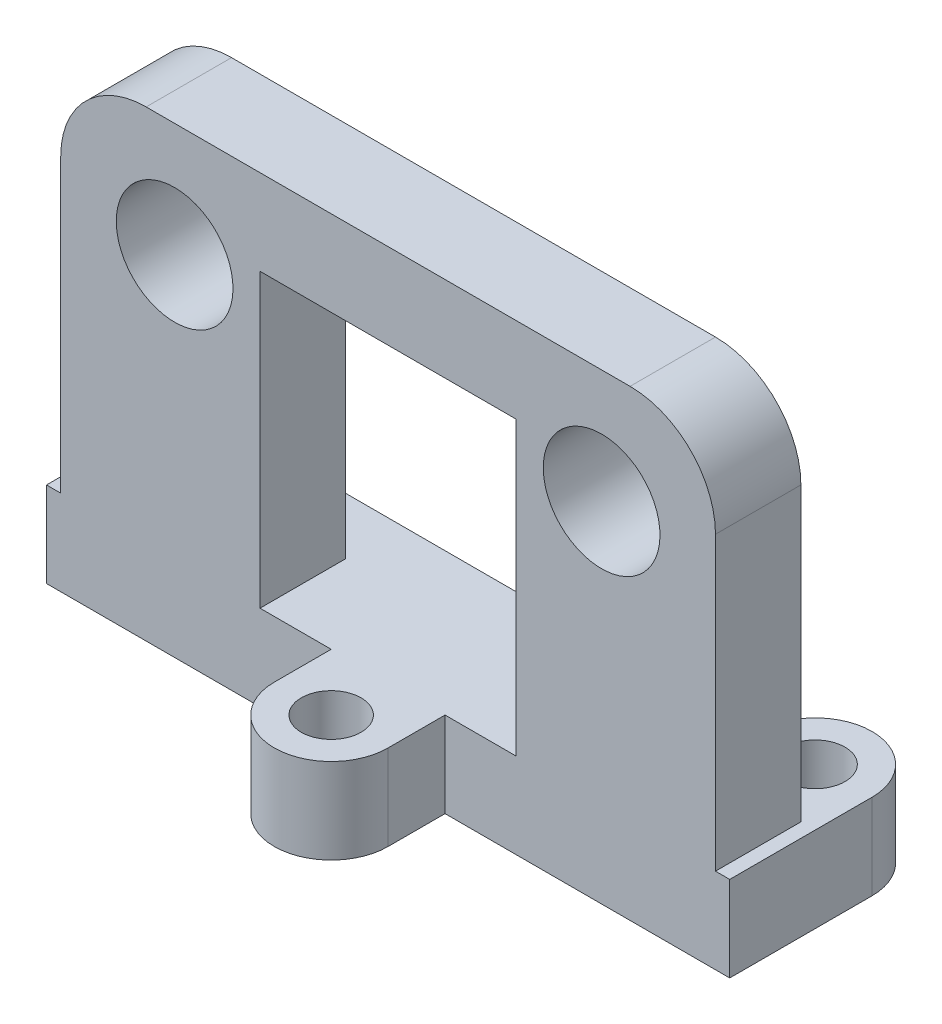
ISO-10303-21;
HEADER;
FILE_DESCRIPTION(('STEP AP214'),'2;1');
FILE_NAME('part.step','',(''),(''),'','','');
FILE_SCHEMA(('AUTOMOTIVE_DESIGN { 1 0 10303 214 1 1 1 1 }'));
ENDSEC;
DATA;
#1=APPLICATION_CONTEXT('core data for automotive mechanical design processes');
#2=APPLICATION_PROTOCOL_DEFINITION('international standard','automotive_design',2000,#1);
#3=PRODUCT_CONTEXT('',#1,'mechanical');
#4=PRODUCT('Part','Part','',(#3));
#5=PRODUCT_RELATED_PRODUCT_CATEGORY('part','',(#4));
#6=PRODUCT_DEFINITION_FORMATION('','',#4);
#7=PRODUCT_DEFINITION_CONTEXT('part definition',#1,'design');
#8=PRODUCT_DEFINITION('design','',#6,#7);
#9=PRODUCT_DEFINITION_SHAPE('','',#8);
#10=(LENGTH_UNIT() NAMED_UNIT(*) SI_UNIT(.MILLI.,.METRE.));
#11=(NAMED_UNIT(*) PLANE_ANGLE_UNIT() SI_UNIT($,.RADIAN.));
#12=(NAMED_UNIT(*) SI_UNIT($,.STERADIAN.) SOLID_ANGLE_UNIT());
#13=UNCERTAINTY_MEASURE_WITH_UNIT(LENGTH_MEASURE(1.E-05),#10,'distance_accuracy_value','');
#14=(GEOMETRIC_REPRESENTATION_CONTEXT(3) GLOBAL_UNCERTAINTY_ASSIGNED_CONTEXT((#13)) GLOBAL_UNIT_ASSIGNED_CONTEXT((#10,
#11,#12)) REPRESENTATION_CONTEXT('',''));
#15=CARTESIAN_POINT('',(0.,0.,0.));
#16=DIRECTION('',(0.,0.,1.));
#17=DIRECTION('',(1.,0.,0.));
#18=AXIS2_PLACEMENT_3D('',#15,#16,#17);
#19=CARTESIAN_POINT('',(16.,16.25,18.));
#20=DIRECTION('',(1.,0.,0.));
#21=DIRECTION('',(0.,1.,0.));
#22=AXIS2_PLACEMENT_3D('',#19,#20,#21);
#23=PLANE('',#22);
#24=DIRECTION('',(0.,0.,1.));
#25=VECTOR('',#24,1.);
#26=CARTESIAN_POINT('',(16.,13.25,0.));
#27=LINE('',#26,#25);
#28=CARTESIAN_POINT('',(16.,13.25,-3.));
#29=VERTEX_POINT('',#28);
#30=CARTESIAN_POINT('',(16.,13.25,0.));
#31=VERTEX_POINT('',#30);
#32=EDGE_CURVE('E203',#29,#31,#27,.T.);
#33=ORIENTED_EDGE('',*,*,#32,.F.);
#34=DIRECTION('',(0.,-1.,0.));
#35=VECTOR('',#34,1.);
#36=CARTESIAN_POINT('',(16.,16.25,-3.));
#37=LINE('',#36,#35);
#38=CARTESIAN_POINT('',(16.,3.,-3.));
#39=VERTEX_POINT('',#38);
#40=EDGE_CURVE('E196',#29,#39,#37,.T.);
#41=ORIENTED_EDGE('',*,*,#40,.T.);
#42=DIRECTION('',(0.,0.,-1.));
#43=VECTOR('',#42,1.);
#44=CARTESIAN_POINT('',(16.,3.,18.));
#45=LINE('',#44,#43);
#46=CARTESIAN_POINT('',(16.,3.,0.));
#47=VERTEX_POINT('',#46);
#48=EDGE_CURVE('E207',#47,#39,#45,.T.);
#49=ORIENTED_EDGE('',*,*,#48,.F.);
#50=DIRECTION('',(0.,-1.,0.));
#51=VECTOR('',#50,1.);
#52=CARTESIAN_POINT('',(16.,0.,0.));
#53=LINE('',#52,#51);
#54=EDGE_CURVE('E257',#31,#47,#53,.T.);
#55=ORIENTED_EDGE('',*,*,#54,.F.);
#56=EDGE_LOOP('',(#33,#41,#49,#55));
#57=FACE_BOUND('',#56,.T.);
#58=ADVANCED_FACE('F41',(#57),#23,.F.);
#59=CARTESIAN_POINT('',(7.,16.25,18.));
#60=DIRECTION('',(-1.,0.,0.));
#61=DIRECTION('',(0.,-1.,0.));
#62=AXIS2_PLACEMENT_3D('',#59,#60,#61);
#63=PLANE('',#62);
#64=DIRECTION('',(0.,0.,1.));
#65=VECTOR('',#64,1.);
#66=CARTESIAN_POINT('',(7.,13.25,0.));
#67=LINE('',#66,#65);
#68=CARTESIAN_POINT('',(7.,13.25,-3.));
#69=VERTEX_POINT('',#68);
#70=CARTESIAN_POINT('',(7.,13.25,0.));
#71=VERTEX_POINT('',#70);
#72=EDGE_CURVE('E177',#69,#71,#67,.T.);
#73=ORIENTED_EDGE('',*,*,#72,.T.);
#74=DIRECTION('',(0.,1.,0.));
#75=VECTOR('',#74,1.);
#76=CARTESIAN_POINT('',(7.,0.,0.));
#77=LINE('',#76,#75);
#78=CARTESIAN_POINT('',(7.,3.,0.));
#79=VERTEX_POINT('',#78);
#80=EDGE_CURVE('E258',#79,#71,#77,.T.);
#81=ORIENTED_EDGE('',*,*,#80,.F.);
#82=DIRECTION('',(0.,0.,-1.));
#83=VECTOR('',#82,1.);
#84=CARTESIAN_POINT('',(7.,3.,18.));
#85=LINE('',#84,#83);
#86=CARTESIAN_POINT('',(7.,3.,-3.));
#87=VERTEX_POINT('',#86);
#88=EDGE_CURVE('E201',#79,#87,#85,.T.);
#89=ORIENTED_EDGE('',*,*,#88,.T.);
#90=DIRECTION('',(0.,1.,0.));
#91=VECTOR('',#90,1.);
#92=CARTESIAN_POINT('',(7.,16.25,-3.));
#93=LINE('',#92,#91);
#94=EDGE_CURVE('E199',#87,#69,#93,.T.);
#95=ORIENTED_EDGE('',*,*,#94,.T.);
#96=EDGE_LOOP('',(#73,#81,#89,#95));
#97=FACE_BOUND('',#96,.T.);
#98=ADVANCED_FACE('F202',(#97),#63,.F.);
#99=CARTESIAN_POINT('',(23.,3.,-5.));
#100=DIRECTION('',(0.,0.,1.));
#101=DIRECTION('',(1.,0.,0.));
#102=AXIS2_PLACEMENT_3D('',#99,#100,#101);
#103=PLANE('',#102);
#104=DIRECTION('',(0.,1.,0.));
#105=VECTOR('',#104,1.);
#106=CARTESIAN_POINT('',(19.5,-8.06225774829855,-5.));
#107=LINE('',#106,#105);
#108=CARTESIAN_POINT('',(19.5,0.,-5.));
#109=VERTEX_POINT('',#108);
#110=CARTESIAN_POINT('',(19.5,3.,-5.));
#111=VERTEX_POINT('',#110);
#112=EDGE_CURVE('E364',#109,#111,#107,.T.);
#113=ORIENTED_EDGE('',*,*,#112,.F.);
#114=DIRECTION('',(-1.,0.,0.));
#115=VECTOR('',#114,1.);
#116=CARTESIAN_POINT('',(23.,0.,-5.));
#117=LINE('',#116,#115);
#118=CARTESIAN_POINT('',(3.5,0.,-5.));
#119=VERTEX_POINT('',#118);
#120=EDGE_CURVE('E249',#109,#119,#117,.T.);
#121=ORIENTED_EDGE('',*,*,#120,.T.);
#122=DIRECTION('',(0.,1.,0.));
#123=VECTOR('',#122,1.);
#124=CARTESIAN_POINT('',(3.5,-8.06225774829855,-5.));
#125=LINE('',#124,#123);
#126=CARTESIAN_POINT('',(3.5,3.,-5.));
#127=VERTEX_POINT('',#126);
#128=EDGE_CURVE('E308',#119,#127,#125,.T.);
#129=ORIENTED_EDGE('',*,*,#128,.T.);
#130=DIRECTION('',(-1.,0.,0.));
#131=VECTOR('',#130,1.);
#132=CARTESIAN_POINT('',(23.,3.,-5.));
#133=LINE('',#132,#131);
#134=EDGE_CURVE('E247',#111,#127,#133,.T.);
#135=ORIENTED_EDGE('',*,*,#134,.F.);
#136=EDGE_LOOP('',(#113,#121,#129,#135));
#137=FACE_BOUND('',#136,.T.);
#138=ADVANCED_FACE('F423',(#137),#103,.F.);
#139=CARTESIAN_POINT('',(23.,0.,-5.));
#140=DIRECTION('',(0.,1.,0.));
#141=DIRECTION('',(0.,0.,1.));
#142=AXIS2_PLACEMENT_3D('',#139,#140,#141);
#143=PLANE('',#142);
#144=CARTESIAN_POINT('',(1.5,0.,-5.));
#145=DIRECTION('',(0.,1.,0.));
#146=DIRECTION('',(0.,0.,1.));
#147=AXIS2_PLACEMENT_3D('',#144,#145,#146);
#148=CIRCLE('',#147,1.05);
#149=CARTESIAN_POINT('',(1.5,0.,-3.95));
#150=VERTEX_POINT('',#149);
#151=EDGE_CURVE('E385',#150,#150,#148,.T.);
#152=ORIENTED_EDGE('',*,*,#151,.T.);
#153=EDGE_LOOP('',(#152));
#154=FACE_BOUND('',#153,.T.);
#155=CARTESIAN_POINT('',(11.5,0.,2.));
#156=DIRECTION('',(0.,1.,0.));
#157=DIRECTION('',(0.,0.,1.));
#158=AXIS2_PLACEMENT_3D('',#155,#156,#157);
#159=CIRCLE('',#158,1.05);
#160=CARTESIAN_POINT('',(11.5,0.,3.05));
#161=VERTEX_POINT('',#160);
#162=EDGE_CURVE('E387',#161,#161,#159,.T.);
#163=ORIENTED_EDGE('',*,*,#162,.T.);
#164=EDGE_LOOP('',(#163));
#165=FACE_BOUND('',#164,.T.);
#166=CARTESIAN_POINT('',(21.5,0.,-5.));
#167=DIRECTION('',(0.,1.,0.));
#168=DIRECTION('',(0.,0.,1.));
#169=AXIS2_PLACEMENT_3D('',#166,#167,#168);
#170=CIRCLE('',#169,1.05);
#171=CARTESIAN_POINT('',(21.5,0.,-3.95));
#172=VERTEX_POINT('',#171);
#173=EDGE_CURVE('E359',#172,#172,#170,.T.);
#174=ORIENTED_EDGE('',*,*,#173,.T.);
#175=EDGE_LOOP('',(#174));
#176=FACE_BOUND('',#175,.T.);
#177=ORIENTED_EDGE('',*,*,#120,.F.);
#178=CARTESIAN_POINT('',(21.5,0.,-5.));
#179=DIRECTION('',(0.,1.,0.));
#180=DIRECTION('',(0.,0.,1.));
#181=AXIS2_PLACEMENT_3D('',#178,#179,#180);
#182=CIRCLE('',#181,2.);
#183=CARTESIAN_POINT('',(23.5,0.,-5.));
#184=VERTEX_POINT('',#183);
#185=EDGE_CURVE('E343',#184,#109,#182,.T.);
#186=ORIENTED_EDGE('',*,*,#185,.F.);
#187=DIRECTION('',(0.,0.,-1.));
#188=VECTOR('',#187,1.);
#189=CARTESIAN_POINT('',(23.5,0.,0.));
#190=LINE('',#189,#188);
#191=CARTESIAN_POINT('',(23.5,0.,0.));
#192=VERTEX_POINT('',#191);
#193=EDGE_CURVE('E330',#192,#184,#190,.T.);
#194=ORIENTED_EDGE('',*,*,#193,.F.);
#195=DIRECTION('',(-1.,0.,0.));
#196=VECTOR('',#195,1.);
#197=CARTESIAN_POINT('',(23.,0.,0.));
#198=LINE('',#197,#196);
#199=CARTESIAN_POINT('',(13.5,0.,0.));
#200=VERTEX_POINT('',#199);
#201=EDGE_CURVE('E240',#192,#200,#198,.T.);
#202=ORIENTED_EDGE('',*,*,#201,.T.);
#203=DIRECTION('',(0.,0.,-1.));
#204=VECTOR('',#203,1.);
#205=CARTESIAN_POINT('',(13.5,0.,0.));
#206=LINE('',#205,#204);
#207=CARTESIAN_POINT('',(13.5,0.,2.));
#208=VERTEX_POINT('',#207);
#209=EDGE_CURVE('E361',#208,#200,#206,.T.);
#210=ORIENTED_EDGE('',*,*,#209,.F.);
#211=CARTESIAN_POINT('',(11.5,0.,2.));
#212=DIRECTION('',(0.,1.,0.));
#213=DIRECTION('',(0.,0.,1.));
#214=AXIS2_PLACEMENT_3D('',#211,#212,#213);
#215=CIRCLE('',#214,2.);
#216=CARTESIAN_POINT('',(9.5,0.,2.));
#217=VERTEX_POINT('',#216);
#218=EDGE_CURVE('E357',#208,#217,#215,.F.);
#219=ORIENTED_EDGE('',*,*,#218,.T.);
#220=DIRECTION('',(0.,0.,1.));
#221=VECTOR('',#220,1.);
#222=CARTESIAN_POINT('',(9.5,0.,2.));
#223=LINE('',#222,#221);
#224=CARTESIAN_POINT('',(9.5,0.,0.));
#225=VERTEX_POINT('',#224);
#226=EDGE_CURVE('E360',#225,#217,#223,.T.);
#227=ORIENTED_EDGE('',*,*,#226,.F.);
#228=CARTESIAN_POINT('',(-0.5,0.,0.));
#229=VERTEX_POINT('',#228);
#230=EDGE_CURVE('E234',#225,#229,#198,.T.);
#231=ORIENTED_EDGE('',*,*,#230,.T.);
#232=DIRECTION('',(0.,0.,-1.));
#233=VECTOR('',#232,1.);
#234=CARTESIAN_POINT('',(-0.5,0.,0.));
#235=LINE('',#234,#233);
#236=CARTESIAN_POINT('',(-0.5,0.,-5.));
#237=VERTEX_POINT('',#236);
#238=EDGE_CURVE('E316',#229,#237,#235,.T.);
#239=ORIENTED_EDGE('',*,*,#238,.T.);
#240=CARTESIAN_POINT('',(1.5,0.,-5.));
#241=DIRECTION('',(0.,1.,0.));
#242=DIRECTION('',(0.,0.,1.));
#243=AXIS2_PLACEMENT_3D('',#240,#241,#242);
#244=CIRCLE('',#243,2.);
#245=EDGE_CURVE('E208',#237,#119,#244,.F.);
#246=ORIENTED_EDGE('',*,*,#245,.T.);
#247=EDGE_LOOP('',(#177,#186,#194,#202,#210,#219,#227,#231,#239,#246));
#248=FACE_BOUND('',#247,.T.);
#249=ADVANCED_FACE('F415',(#154,#165,#176,#248),#143,.F.);
#250=CARTESIAN_POINT('',(23.,3.,-3.));
#251=DIRECTION('',(0.,-1.,0.));
#252=DIRECTION('',(0.,0.,-1.));
#253=AXIS2_PLACEMENT_3D('',#250,#251,#252);
#254=PLANE('',#253);
#255=CARTESIAN_POINT('',(1.5,3.,-5.));
#256=DIRECTION('',(0.,1.,0.));
#257=DIRECTION('',(0.,0.,1.));
#258=AXIS2_PLACEMENT_3D('',#255,#256,#257);
#259=CIRCLE('',#258,1.05);
#260=CARTESIAN_POINT('',(1.5,3.,-3.95));
#261=VERTEX_POINT('',#260);
#262=EDGE_CURVE('E188',#261,#261,#259,.T.);
#263=ORIENTED_EDGE('',*,*,#262,.F.);
#264=EDGE_LOOP('',(#263));
#265=FACE_BOUND('',#264,.T.);
#266=CARTESIAN_POINT('',(11.5,3.,2.));
#267=DIRECTION('',(0.,1.,0.));
#268=DIRECTION('',(0.,0.,1.));
#269=AXIS2_PLACEMENT_3D('',#266,#267,#268);
#270=CIRCLE('',#269,1.05);
#271=CARTESIAN_POINT('',(11.5,3.,3.05));
#272=VERTEX_POINT('',#271);
#273=EDGE_CURVE('E383',#272,#272,#270,.T.);
#274=ORIENTED_EDGE('',*,*,#273,.F.);
#275=EDGE_LOOP('',(#274));
#276=FACE_BOUND('',#275,.T.);
#277=CARTESIAN_POINT('',(21.5,3.,-5.));
#278=DIRECTION('',(0.,1.,0.));
#279=DIRECTION('',(0.,0.,1.));
#280=AXIS2_PLACEMENT_3D('',#277,#278,#279);
#281=CIRCLE('',#280,1.05);
#282=CARTESIAN_POINT('',(21.5,3.,-3.95));
#283=VERTEX_POINT('',#282);
#284=EDGE_CURVE('E393',#283,#283,#281,.T.);
#285=ORIENTED_EDGE('',*,*,#284,.F.);
#286=EDGE_LOOP('',(#285));
#287=FACE_BOUND('',#286,.T.);
#288=CARTESIAN_POINT('',(21.5,3.,-5.));
#289=DIRECTION('',(0.,1.,0.));
#290=DIRECTION('',(0.,0.,1.));
#291=AXIS2_PLACEMENT_3D('',#288,#289,#290);
#292=CIRCLE('',#291,2.);
#293=CARTESIAN_POINT('',(23.5,3.,-5.));
#294=VERTEX_POINT('',#293);
#295=EDGE_CURVE('E333',#111,#294,#292,.F.);
#296=ORIENTED_EDGE('',*,*,#295,.F.);
#297=ORIENTED_EDGE('',*,*,#134,.T.);
#298=CARTESIAN_POINT('',(1.5,3.,-5.));
#299=DIRECTION('',(0.,1.,0.));
#300=DIRECTION('',(0.,0.,1.));
#301=AXIS2_PLACEMENT_3D('',#298,#299,#300);
#302=CIRCLE('',#301,2.);
#303=CARTESIAN_POINT('',(-0.5,3.,-5.));
#304=VERTEX_POINT('',#303);
#305=EDGE_CURVE('E312',#127,#304,#302,.T.);
#306=ORIENTED_EDGE('',*,*,#305,.T.);
#307=DIRECTION('',(0.,0.,1.));
#308=VECTOR('',#307,1.);
#309=CARTESIAN_POINT('',(-0.5,3.,0.));
#310=LINE('',#309,#308);
#311=CARTESIAN_POINT('',(-0.5,3.,0.));
#312=VERTEX_POINT('',#311);
#313=EDGE_CURVE('E306',#304,#312,#310,.T.);
#314=ORIENTED_EDGE('',*,*,#313,.T.);
#315=DIRECTION('',(1.,0.,0.));
#316=VECTOR('',#315,1.);
#317=CARTESIAN_POINT('',(0.,3.,0.));
#318=LINE('',#317,#316);
#319=CARTESIAN_POINT('',(0.,3.,0.));
#320=VERTEX_POINT('',#319);
#321=EDGE_CURVE('E303',#312,#320,#318,.T.);
#322=ORIENTED_EDGE('',*,*,#321,.T.);
#323=DIRECTION('',(0.,0.,-1.));
#324=VECTOR('',#323,1.);
#325=CARTESIAN_POINT('',(0.,3.,0.));
#326=LINE('',#325,#324);
#327=CARTESIAN_POINT('',(0.,3.,-3.));
#328=VERTEX_POINT('',#327);
#329=EDGE_CURVE('E256',#320,#328,#326,.T.);
#330=ORIENTED_EDGE('',*,*,#329,.T.);
#331=DIRECTION('',(-1.,0.,0.));
#332=VECTOR('',#331,1.);
#333=CARTESIAN_POINT('',(23.,3.,-3.));
#334=LINE('',#333,#332);
#335=EDGE_CURVE('E244',#87,#328,#334,.T.);
#336=ORIENTED_EDGE('',*,*,#335,.F.);
#337=ORIENTED_EDGE('',*,*,#88,.F.);
#338=DIRECTION('',(-1.,0.,0.));
#339=VECTOR('',#338,1.);
#340=CARTESIAN_POINT('',(23.,3.,0.));
#341=LINE('',#340,#339);
#342=CARTESIAN_POINT('',(9.5,3.,0.));
#343=VERTEX_POINT('',#342);
#344=EDGE_CURVE('E255',#343,#79,#341,.T.);
#345=ORIENTED_EDGE('',*,*,#344,.F.);
#346=DIRECTION('',(0.,0.,-1.));
#347=VECTOR('',#346,1.);
#348=CARTESIAN_POINT('',(9.5,3.,2.));
#349=LINE('',#348,#347);
#350=CARTESIAN_POINT('',(9.5,3.,2.));
#351=VERTEX_POINT('',#350);
#352=EDGE_CURVE('E352',#351,#343,#349,.T.);
#353=ORIENTED_EDGE('',*,*,#352,.F.);
#354=CARTESIAN_POINT('',(11.5,3.,2.));
#355=DIRECTION('',(0.,1.,0.));
#356=DIRECTION('',(0.,0.,1.));
#357=AXIS2_PLACEMENT_3D('',#354,#355,#356);
#358=CIRCLE('',#357,2.);
#359=CARTESIAN_POINT('',(13.5,3.,2.));
#360=VERTEX_POINT('',#359);
#361=EDGE_CURVE('E342',#351,#360,#358,.T.);
#362=ORIENTED_EDGE('',*,*,#361,.T.);
#363=DIRECTION('',(0.,0.,1.));
#364=VECTOR('',#363,1.);
#365=CARTESIAN_POINT('',(13.5,3.,0.));
#366=LINE('',#365,#364);
#367=CARTESIAN_POINT('',(13.5,3.,0.));
#368=VERTEX_POINT('',#367);
#369=EDGE_CURVE('E349',#368,#360,#366,.T.);
#370=ORIENTED_EDGE('',*,*,#369,.F.);
#371=EDGE_CURVE('E254',#47,#368,#341,.T.);
#372=ORIENTED_EDGE('',*,*,#371,.F.);
#373=ORIENTED_EDGE('',*,*,#48,.T.);
#374=CARTESIAN_POINT('',(23.,3.,-3.));
#375=VERTEX_POINT('',#374);
#376=EDGE_CURVE('E246',#375,#39,#334,.T.);
#377=ORIENTED_EDGE('',*,*,#376,.F.);
#378=DIRECTION('',(0.,0.,-1.));
#379=VECTOR('',#378,1.);
#380=CARTESIAN_POINT('',(23.,3.,0.));
#381=LINE('',#380,#379);
#382=CARTESIAN_POINT('',(23.,3.,0.));
#383=VERTEX_POINT('',#382);
#384=EDGE_CURVE('E282',#383,#375,#381,.T.);
#385=ORIENTED_EDGE('',*,*,#384,.F.);
#386=DIRECTION('',(-1.,0.,0.));
#387=VECTOR('',#386,1.);
#388=CARTESIAN_POINT('',(0.,3.,0.));
#389=LINE('',#388,#387);
#390=CARTESIAN_POINT('',(23.5,3.,0.));
#391=VERTEX_POINT('',#390);
#392=EDGE_CURVE('E336',#391,#383,#389,.T.);
#393=ORIENTED_EDGE('',*,*,#392,.F.);
#394=DIRECTION('',(0.,0.,1.));
#395=VECTOR('',#394,1.);
#396=CARTESIAN_POINT('',(23.5,3.,0.));
#397=LINE('',#396,#395);
#398=EDGE_CURVE('E366',#294,#391,#397,.T.);
#399=ORIENTED_EDGE('',*,*,#398,.F.);
#400=EDGE_LOOP('',(#296,#297,#306,#314,#322,#330,#336,#337,#345,#353,#362,#370,#372,#373,#377,
#385,#393,#399));
#401=FACE_BOUND('',#400,.T.);
#402=ADVANCED_FACE('F301',(#265,#276,#287,#401),#254,.F.);
#403=CARTESIAN_POINT('',(23.,16.25,-3.));
#404=DIRECTION('',(0.,0.,1.));
#405=DIRECTION('',(0.,-1.,0.));
#406=AXIS2_PLACEMENT_3D('',#403,#404,#405);
#407=PLANE('',#406);
#408=CARTESIAN_POINT('',(4.,12.25,-3.));
#409=DIRECTION('',(0.,0.,-1.));
#410=DIRECTION('',(0.,1.,0.));
#411=AXIS2_PLACEMENT_3D('',#408,#409,#410);
#412=CIRCLE('',#411,2.05);
#413=CARTESIAN_POINT('',(4.,14.3,-3.));
#414=VERTEX_POINT('',#413);
#415=EDGE_CURVE('E223',#414,#414,#412,.T.);
#416=ORIENTED_EDGE('',*,*,#415,.F.);
#417=EDGE_LOOP('',(#416));
#418=FACE_BOUND('',#417,.T.);
#419=DIRECTION('',(-1.,0.,0.));
#420=VECTOR('',#419,1.);
#421=CARTESIAN_POINT('',(23.,16.25,-3.));
#422=LINE('',#421,#420);
#423=CARTESIAN_POINT('',(20.,16.25,-3.));
#424=VERTEX_POINT('',#423);
#425=CARTESIAN_POINT('',(3.,16.25,-3.));
#426=VERTEX_POINT('',#425);
#427=EDGE_CURVE('E243',#424,#426,#422,.T.);
#428=ORIENTED_EDGE('',*,*,#427,.F.);
#429=CARTESIAN_POINT('',(20.,13.25,-3.));
#430=DIRECTION('',(0.,0.,1.));
#431=DIRECTION('',(0.,-1.,0.));
#432=AXIS2_PLACEMENT_3D('',#429,#430,#431);
#433=CIRCLE('',#432,3.);
#434=CARTESIAN_POINT('',(23.,13.25,-3.));
#435=VERTEX_POINT('',#434);
#436=EDGE_CURVE('E47',#424,#435,#433,.F.);
#437=ORIENTED_EDGE('',*,*,#436,.T.);
#438=DIRECTION('',(0.,1.,0.));
#439=VECTOR('',#438,1.);
#440=CARTESIAN_POINT('',(23.,16.25,-3.));
#441=LINE('',#440,#439);
#442=EDGE_CURVE('E226',#375,#435,#441,.T.);
#443=ORIENTED_EDGE('',*,*,#442,.F.);
#444=ORIENTED_EDGE('',*,*,#376,.T.);
#445=ORIENTED_EDGE('',*,*,#40,.F.);
#446=DIRECTION('',(1.,0.,0.));
#447=VECTOR('',#446,1.);
#448=CARTESIAN_POINT('',(2.75735931288072,13.25,-3.));
#449=LINE('',#448,#447);
#450=EDGE_CURVE('E182',#69,#29,#449,.T.);
#451=ORIENTED_EDGE('',*,*,#450,.F.);
#452=ORIENTED_EDGE('',*,*,#94,.F.);
#453=ORIENTED_EDGE('',*,*,#335,.T.);
#454=DIRECTION('',(0.,1.,0.));
#455=VECTOR('',#454,1.);
#456=CARTESIAN_POINT('',(0.,16.25,-3.));
#457=LINE('',#456,#455);
#458=CARTESIAN_POINT('',(0.,13.25,-3.));
#459=VERTEX_POINT('',#458);
#460=EDGE_CURVE('E227',#328,#459,#457,.T.);
#461=ORIENTED_EDGE('',*,*,#460,.T.);
#462=CARTESIAN_POINT('',(3.,13.25,-3.));
#463=DIRECTION('',(0.,0.,1.));
#464=DIRECTION('',(0.,-1.,0.));
#465=AXIS2_PLACEMENT_3D('',#462,#463,#464);
#466=CIRCLE('',#465,3.);
#467=EDGE_CURVE('E63',#459,#426,#466,.F.);
#468=ORIENTED_EDGE('',*,*,#467,.T.);
#469=EDGE_LOOP('',(#428,#437,#443,#444,#445,#451,#452,#453,#461,#468));
#470=FACE_BOUND('',#469,.T.);
#471=CARTESIAN_POINT('',(19.,12.25,-3.));
#472=DIRECTION('',(0.,0.,-1.));
#473=DIRECTION('',(0.,1.,0.));
#474=AXIS2_PLACEMENT_3D('',#471,#472,#473);
#475=CIRCLE('',#474,2.05);
#476=CARTESIAN_POINT('',(19.,14.3,-3.));
#477=VERTEX_POINT('',#476);
#478=EDGE_CURVE('E215',#477,#477,#475,.T.);
#479=ORIENTED_EDGE('',*,*,#478,.F.);
#480=EDGE_LOOP('',(#479));
#481=FACE_BOUND('',#480,.T.);
#482=ADVANCED_FACE('F195',(#418,#470,#481),#407,.F.);
#483=CARTESIAN_POINT('',(23.,16.25,0.));
#484=DIRECTION('',(0.,-1.,0.));
#485=DIRECTION('',(0.,0.,-1.));
#486=AXIS2_PLACEMENT_3D('',#483,#484,#485);
#487=PLANE('',#486);
#488=DIRECTION('',(-1.,0.,0.));
#489=VECTOR('',#488,1.);
#490=CARTESIAN_POINT('',(23.,16.25,0.));
#491=LINE('',#490,#489);
#492=CARTESIAN_POINT('',(20.,16.25,0.));
#493=VERTEX_POINT('',#492);
#494=CARTESIAN_POINT('',(3.,16.25,0.));
#495=VERTEX_POINT('',#494);
#496=EDGE_CURVE('E239',#493,#495,#491,.T.);
#497=ORIENTED_EDGE('',*,*,#496,.F.);
#498=DIRECTION('',(0.,0.,1.));
#499=VECTOR('',#498,1.);
#500=CARTESIAN_POINT('',(20.,16.25,0.));
#501=LINE('',#500,#499);
#502=EDGE_CURVE('E275',#493,#424,#501,.F.);
#503=ORIENTED_EDGE('',*,*,#502,.T.);
#504=ORIENTED_EDGE('',*,*,#427,.T.);
#505=DIRECTION('',(0.,0.,1.));
#506=VECTOR('',#505,1.);
#507=CARTESIAN_POINT('',(3.,16.25,0.));
#508=LINE('',#507,#506);
#509=EDGE_CURVE('E270',#426,#495,#508,.T.);
#510=ORIENTED_EDGE('',*,*,#509,.T.);
#511=EDGE_LOOP('',(#497,#503,#504,#510));
#512=FACE_BOUND('',#511,.T.);
#513=ADVANCED_FACE('F292',(#512),#487,.F.);
#514=CARTESIAN_POINT('',(23.,0.,0.));
#515=DIRECTION('',(0.,0.,-1.));
#516=DIRECTION('',(-1.,0.,0.));
#517=AXIS2_PLACEMENT_3D('',#514,#515,#516);
#518=PLANE('',#517);
#519=DIRECTION('',(0.,-1.,0.));
#520=VECTOR('',#519,1.);
#521=CARTESIAN_POINT('',(23.,0.,0.));
#522=LINE('',#521,#520);
#523=CARTESIAN_POINT('',(23.,13.25,0.));
#524=VERTEX_POINT('',#523);
#525=EDGE_CURVE('E233',#524,#383,#522,.T.);
#526=ORIENTED_EDGE('',*,*,#525,.F.);
#527=CARTESIAN_POINT('',(20.,13.25,0.));
#528=DIRECTION('',(0.,0.,-1.));
#529=DIRECTION('',(-1.,0.,0.));
#530=AXIS2_PLACEMENT_3D('',#527,#528,#529);
#531=CIRCLE('',#530,3.);
#532=EDGE_CURVE('E269',#524,#493,#531,.F.);
#533=ORIENTED_EDGE('',*,*,#532,.T.);
#534=ORIENTED_EDGE('',*,*,#496,.T.);
#535=CARTESIAN_POINT('',(3.,13.25,0.));
#536=DIRECTION('',(0.,0.,-1.));
#537=DIRECTION('',(-1.,0.,0.));
#538=AXIS2_PLACEMENT_3D('',#535,#536,#537);
#539=CIRCLE('',#538,3.);
#540=CARTESIAN_POINT('',(0.,13.25,0.));
#541=VERTEX_POINT('',#540);
#542=EDGE_CURVE('E261',#495,#541,#539,.F.);
#543=ORIENTED_EDGE('',*,*,#542,.T.);
#544=DIRECTION('',(0.,-1.,0.));
#545=VECTOR('',#544,1.);
#546=CARTESIAN_POINT('',(0.,0.,0.));
#547=LINE('',#546,#545);
#548=EDGE_CURVE('E235',#541,#320,#547,.T.);
#549=ORIENTED_EDGE('',*,*,#548,.T.);
#550=ORIENTED_EDGE('',*,*,#321,.F.);
#551=DIRECTION('',(0.,1.,0.));
#552=VECTOR('',#551,1.);
#553=CARTESIAN_POINT('',(-0.5,-8.06225774829855,0.));
#554=LINE('',#553,#552);
#555=EDGE_CURVE('E320',#229,#312,#554,.T.);
#556=ORIENTED_EDGE('',*,*,#555,.F.);
#557=ORIENTED_EDGE('',*,*,#230,.F.);
#558=DIRECTION('',(0.,1.,0.));
#559=VECTOR('',#558,1.);
#560=CARTESIAN_POINT('',(9.5,-8.06225774829855,0.));
#561=LINE('',#560,#559);
#562=EDGE_CURVE('E405',#225,#343,#561,.T.);
#563=ORIENTED_EDGE('',*,*,#562,.T.);
#564=ORIENTED_EDGE('',*,*,#344,.T.);
#565=ORIENTED_EDGE('',*,*,#80,.T.);
#566=DIRECTION('',(1.,0.,0.));
#567=VECTOR('',#566,1.);
#568=CARTESIAN_POINT('',(2.75735931288072,13.25,0.));
#569=LINE('',#568,#567);
#570=EDGE_CURVE('E184',#71,#31,#569,.T.);
#571=ORIENTED_EDGE('',*,*,#570,.T.);
#572=ORIENTED_EDGE('',*,*,#54,.T.);
#573=ORIENTED_EDGE('',*,*,#371,.T.);
#574=DIRECTION('',(0.,1.,0.));
#575=VECTOR('',#574,1.);
#576=CARTESIAN_POINT('',(13.5,-8.06225774829855,0.));
#577=LINE('',#576,#575);
#578=EDGE_CURVE('E396',#200,#368,#577,.T.);
#579=ORIENTED_EDGE('',*,*,#578,.F.);
#580=ORIENTED_EDGE('',*,*,#201,.F.);
#581=DIRECTION('',(0.,1.,0.));
#582=VECTOR('',#581,1.);
#583=CARTESIAN_POINT('',(23.5,-8.06225774829855,0.));
#584=LINE('',#583,#582);
#585=EDGE_CURVE('E370',#192,#391,#584,.T.);
#586=ORIENTED_EDGE('',*,*,#585,.T.);
#587=ORIENTED_EDGE('',*,*,#392,.T.);
#588=EDGE_LOOP('',(#526,#533,#534,#543,#549,#550,#556,#557,#563,#564,#565,#571,#572,#573,#579,
#580,#586,#587));
#589=FACE_BOUND('',#588,.T.);
#590=CARTESIAN_POINT('',(4.,12.25,0.));
#591=DIRECTION('',(0.,0.,-1.));
#592=DIRECTION('',(0.,1.,0.));
#593=AXIS2_PLACEMENT_3D('',#590,#591,#592);
#594=CIRCLE('',#593,2.05);
#595=CARTESIAN_POINT('',(4.,14.3,0.));
#596=VERTEX_POINT('',#595);
#597=EDGE_CURVE('E225',#596,#596,#594,.T.);
#598=ORIENTED_EDGE('',*,*,#597,.T.);
#599=EDGE_LOOP('',(#598));
#600=FACE_BOUND('',#599,.T.);
#601=CARTESIAN_POINT('',(19.,12.25,0.));
#602=DIRECTION('',(0.,0.,-1.));
#603=DIRECTION('',(0.,1.,0.));
#604=AXIS2_PLACEMENT_3D('',#601,#602,#603);
#605=CIRCLE('',#604,2.05);
#606=CARTESIAN_POINT('',(19.,14.3,0.));
#607=VERTEX_POINT('',#606);
#608=EDGE_CURVE('E217',#607,#607,#605,.T.);
#609=ORIENTED_EDGE('',*,*,#608,.T.);
#610=EDGE_LOOP('',(#609));
#611=FACE_BOUND('',#610,.T.);
#612=ADVANCED_FACE('F287',(#589,#600,#611),#518,.F.);
#613=CARTESIAN_POINT('',(23.,0.,0.));
#614=DIRECTION('',(-1.,0.,0.));
#615=DIRECTION('',(0.,0.,1.));
#616=AXIS2_PLACEMENT_3D('',#613,#614,#615);
#617=PLANE('',#616);
#618=ORIENTED_EDGE('',*,*,#442,.T.);
#619=DIRECTION('',(0.,0.,1.));
#620=VECTOR('',#619,1.);
#621=CARTESIAN_POINT('',(23.,13.25,0.));
#622=LINE('',#621,#620);
#623=EDGE_CURVE('E264',#435,#524,#622,.T.);
#624=ORIENTED_EDGE('',*,*,#623,.T.);
#625=ORIENTED_EDGE('',*,*,#525,.T.);
#626=ORIENTED_EDGE('',*,*,#384,.T.);
#627=EDGE_LOOP('',(#618,#624,#625,#626));
#628=FACE_BOUND('',#627,.T.);
#629=ADVANCED_FACE('F276',(#628),#617,.F.);
#630=CARTESIAN_POINT('',(0.,0.,0.));
#631=DIRECTION('',(-1.,0.,0.));
#632=DIRECTION('',(0.,0.,1.));
#633=AXIS2_PLACEMENT_3D('',#630,#631,#632);
#634=PLANE('',#633);
#635=ORIENTED_EDGE('',*,*,#548,.F.);
#636=DIRECTION('',(0.,0.,1.));
#637=VECTOR('',#636,1.);
#638=CARTESIAN_POINT('',(0.,13.25,-3.));
#639=LINE('',#638,#637);
#640=EDGE_CURVE('E11',#541,#459,#639,.F.);
#641=ORIENTED_EDGE('',*,*,#640,.T.);
#642=ORIENTED_EDGE('',*,*,#460,.F.);
#643=ORIENTED_EDGE('',*,*,#329,.F.);
#644=EDGE_LOOP('',(#635,#641,#642,#643));
#645=FACE_BOUND('',#644,.T.);
#646=ADVANCED_FACE('F296',(#645),#634,.T.);
#647=CARTESIAN_POINT('',(4.,12.25,-3.));
#648=DIRECTION('',(0.,0.,-1.));
#649=DIRECTION('',(0.,1.,0.));
#650=AXIS2_PLACEMENT_3D('',#647,#648,#649);
#651=CYLINDRICAL_SURFACE('',#650,2.05);
#652=ORIENTED_EDGE('',*,*,#597,.F.);
#653=EDGE_LOOP('',(#652));
#654=FACE_BOUND('',#653,.T.);
#655=ORIENTED_EDGE('',*,*,#415,.T.);
#656=EDGE_LOOP('',(#655));
#657=FACE_BOUND('',#656,.T.);
#658=ADVANCED_FACE('F447',(#654,#657),#651,.F.);
#659=CARTESIAN_POINT('',(19.,12.25,-3.));
#660=DIRECTION('',(0.,0.,-1.));
#661=DIRECTION('',(0.,1.,0.));
#662=AXIS2_PLACEMENT_3D('',#659,#660,#661);
#663=CYLINDRICAL_SURFACE('',#662,2.05);
#664=ORIENTED_EDGE('',*,*,#608,.F.);
#665=EDGE_LOOP('',(#664));
#666=FACE_BOUND('',#665,.T.);
#667=ORIENTED_EDGE('',*,*,#478,.T.);
#668=EDGE_LOOP('',(#667));
#669=FACE_BOUND('',#668,.T.);
#670=ADVANCED_FACE('F445',(#666,#669),#663,.F.);
#671=CARTESIAN_POINT('',(-0.5,-8.06225774829855,0.));
#672=DIRECTION('',(-1.,0.,0.));
#673=DIRECTION('',(0.,0.,1.));
#674=AXIS2_PLACEMENT_3D('',#671,#672,#673);
#675=PLANE('',#674);
#676=ORIENTED_EDGE('',*,*,#238,.F.);
#677=ORIENTED_EDGE('',*,*,#555,.T.);
#678=ORIENTED_EDGE('',*,*,#313,.F.);
#679=DIRECTION('',(0.,1.,0.));
#680=VECTOR('',#679,1.);
#681=CARTESIAN_POINT('',(-0.5,-8.06225774829855,-5.));
#682=LINE('',#681,#680);
#683=EDGE_CURVE('E311',#237,#304,#682,.T.);
#684=ORIENTED_EDGE('',*,*,#683,.F.);
#685=EDGE_LOOP('',(#676,#677,#678,#684));
#686=FACE_BOUND('',#685,.T.);
#687=ADVANCED_FACE('F444',(#686),#675,.T.);
#688=CARTESIAN_POINT('',(1.5,-8.06225774829855,-5.));
#689=DIRECTION('',(0.,1.,0.));
#690=DIRECTION('',(0.,0.,1.));
#691=AXIS2_PLACEMENT_3D('',#688,#689,#690);
#692=CYLINDRICAL_SURFACE('',#691,2.);
#693=ORIENTED_EDGE('',*,*,#245,.F.);
#694=ORIENTED_EDGE('',*,*,#683,.T.);
#695=ORIENTED_EDGE('',*,*,#305,.F.);
#696=ORIENTED_EDGE('',*,*,#128,.F.);
#697=EDGE_LOOP('',(#693,#694,#695,#696));
#698=FACE_BOUND('',#697,.T.);
#699=ADVANCED_FACE('F416',(#698),#692,.T.);
#700=CARTESIAN_POINT('',(23.5,-8.06225774829855,0.));
#701=DIRECTION('',(-1.,0.,0.));
#702=DIRECTION('',(0.,0.,1.));
#703=AXIS2_PLACEMENT_3D('',#700,#701,#702);
#704=PLANE('',#703);
#705=ORIENTED_EDGE('',*,*,#585,.F.);
#706=ORIENTED_EDGE('',*,*,#193,.T.);
#707=DIRECTION('',(0.,1.,0.));
#708=VECTOR('',#707,1.);
#709=CARTESIAN_POINT('',(23.5,-8.06225774829855,-5.));
#710=LINE('',#709,#708);
#711=EDGE_CURVE('E341',#184,#294,#710,.T.);
#712=ORIENTED_EDGE('',*,*,#711,.T.);
#713=ORIENTED_EDGE('',*,*,#398,.T.);
#714=EDGE_LOOP('',(#705,#706,#712,#713));
#715=FACE_BOUND('',#714,.T.);
#716=ADVANCED_FACE('F419',(#715),#704,.F.);
#717=CARTESIAN_POINT('',(21.5,-8.06225774829855,-5.));
#718=DIRECTION('',(0.,1.,0.));
#719=DIRECTION('',(0.,0.,1.));
#720=AXIS2_PLACEMENT_3D('',#717,#718,#719);
#721=CYLINDRICAL_SURFACE('',#720,2.);
#722=ORIENTED_EDGE('',*,*,#711,.F.);
#723=ORIENTED_EDGE('',*,*,#185,.T.);
#724=ORIENTED_EDGE('',*,*,#112,.T.);
#725=ORIENTED_EDGE('',*,*,#295,.T.);
#726=EDGE_LOOP('',(#722,#723,#724,#725));
#727=FACE_BOUND('',#726,.T.);
#728=ADVANCED_FACE('F422',(#727),#721,.T.);
#729=CARTESIAN_POINT('',(13.5,-8.06225774829855,0.));
#730=DIRECTION('',(-1.,0.,0.));
#731=DIRECTION('',(0.,0.,1.));
#732=AXIS2_PLACEMENT_3D('',#729,#730,#731);
#733=PLANE('',#732);
#734=DIRECTION('',(0.,1.,0.));
#735=VECTOR('',#734,1.);
#736=CARTESIAN_POINT('',(13.5,-8.06225774829855,2.));
#737=LINE('',#736,#735);
#738=EDGE_CURVE('E397',#208,#360,#737,.T.);
#739=ORIENTED_EDGE('',*,*,#738,.F.);
#740=ORIENTED_EDGE('',*,*,#209,.T.);
#741=ORIENTED_EDGE('',*,*,#578,.T.);
#742=ORIENTED_EDGE('',*,*,#369,.T.);
#743=EDGE_LOOP('',(#739,#740,#741,#742));
#744=FACE_BOUND('',#743,.T.);
#745=ADVANCED_FACE('F425',(#744),#733,.F.);
#746=CARTESIAN_POINT('',(9.5,-8.06225774829855,2.));
#747=DIRECTION('',(1.,0.,0.));
#748=DIRECTION('',(0.,0.,-1.));
#749=AXIS2_PLACEMENT_3D('',#746,#747,#748);
#750=PLANE('',#749);
#751=ORIENTED_EDGE('',*,*,#562,.F.);
#752=ORIENTED_EDGE('',*,*,#226,.T.);
#753=DIRECTION('',(0.,1.,0.));
#754=VECTOR('',#753,1.);
#755=CARTESIAN_POINT('',(9.5,-8.06225774829855,2.));
#756=LINE('',#755,#754);
#757=EDGE_CURVE('E399',#217,#351,#756,.T.);
#758=ORIENTED_EDGE('',*,*,#757,.T.);
#759=ORIENTED_EDGE('',*,*,#352,.T.);
#760=EDGE_LOOP('',(#751,#752,#758,#759));
#761=FACE_BOUND('',#760,.T.);
#762=ADVANCED_FACE('F409',(#761),#750,.F.);
#763=CARTESIAN_POINT('',(11.5,-8.06225774829855,2.));
#764=DIRECTION('',(0.,1.,0.));
#765=DIRECTION('',(0.,0.,1.));
#766=AXIS2_PLACEMENT_3D('',#763,#764,#765);
#767=CYLINDRICAL_SURFACE('',#766,2.);
#768=ORIENTED_EDGE('',*,*,#218,.F.);
#769=ORIENTED_EDGE('',*,*,#738,.T.);
#770=ORIENTED_EDGE('',*,*,#361,.F.);
#771=ORIENTED_EDGE('',*,*,#757,.F.);
#772=EDGE_LOOP('',(#768,#769,#770,#771));
#773=FACE_BOUND('',#772,.T.);
#774=ADVANCED_FACE('F486',(#773),#767,.T.);
#775=CARTESIAN_POINT('',(21.5,3.,-5.));
#776=DIRECTION('',(0.,1.,0.));
#777=DIRECTION('',(0.,0.,1.));
#778=AXIS2_PLACEMENT_3D('',#775,#776,#777);
#779=CYLINDRICAL_SURFACE('',#778,1.05);
#780=ORIENTED_EDGE('',*,*,#173,.F.);
#781=EDGE_LOOP('',(#780));
#782=FACE_BOUND('',#781,.T.);
#783=ORIENTED_EDGE('',*,*,#284,.T.);
#784=EDGE_LOOP('',(#783));
#785=FACE_BOUND('',#784,.T.);
#786=ADVANCED_FACE('F485',(#782,#785),#779,.F.);
#787=CARTESIAN_POINT('',(11.5,3.,2.));
#788=DIRECTION('',(0.,1.,0.));
#789=DIRECTION('',(0.,0.,1.));
#790=AXIS2_PLACEMENT_3D('',#787,#788,#789);
#791=CYLINDRICAL_SURFACE('',#790,1.05);
#792=ORIENTED_EDGE('',*,*,#162,.F.);
#793=EDGE_LOOP('',(#792));
#794=FACE_BOUND('',#793,.T.);
#795=ORIENTED_EDGE('',*,*,#273,.T.);
#796=EDGE_LOOP('',(#795));
#797=FACE_BOUND('',#796,.T.);
#798=ADVANCED_FACE('F477',(#794,#797),#791,.F.);
#799=CARTESIAN_POINT('',(1.5,3.,-5.));
#800=DIRECTION('',(0.,1.,0.));
#801=DIRECTION('',(0.,0.,1.));
#802=AXIS2_PLACEMENT_3D('',#799,#800,#801);
#803=CYLINDRICAL_SURFACE('',#802,1.05);
#804=ORIENTED_EDGE('',*,*,#151,.F.);
#805=EDGE_LOOP('',(#804));
#806=FACE_BOUND('',#805,.T.);
#807=ORIENTED_EDGE('',*,*,#262,.T.);
#808=EDGE_LOOP('',(#807));
#809=FACE_BOUND('',#808,.T.);
#810=ADVANCED_FACE('F475',(#806,#809),#803,.F.);
#811=CARTESIAN_POINT('',(2.75735931288072,13.25,0.));
#812=DIRECTION('',(0.,1.,0.));
#813=DIRECTION('',(-1.,0.,0.));
#814=AXIS2_PLACEMENT_3D('',#811,#812,#813);
#815=PLANE('',#814);
#816=ORIENTED_EDGE('',*,*,#72,.F.);
#817=ORIENTED_EDGE('',*,*,#450,.T.);
#818=ORIENTED_EDGE('',*,*,#32,.T.);
#819=ORIENTED_EDGE('',*,*,#570,.F.);
#820=EDGE_LOOP('',(#816,#817,#818,#819));
#821=FACE_BOUND('',#820,.T.);
#822=ADVANCED_FACE('F181',(#821),#815,.F.);
#823=CARTESIAN_POINT('',(20.,13.25,0.));
#824=DIRECTION('',(0.,0.,1.));
#825=DIRECTION('',(1.,0.,0.));
#826=AXIS2_PLACEMENT_3D('',#823,#824,#825);
#827=CYLINDRICAL_SURFACE('',#826,3.);
#828=ORIENTED_EDGE('',*,*,#436,.F.);
#829=ORIENTED_EDGE('',*,*,#502,.F.);
#830=ORIENTED_EDGE('',*,*,#532,.F.);
#831=ORIENTED_EDGE('',*,*,#623,.F.);
#832=EDGE_LOOP('',(#828,#829,#830,#831));
#833=FACE_BOUND('',#832,.T.);
#834=ADVANCED_FACE('F281',(#833),#827,.T.);
#835=CARTESIAN_POINT('',(3.,13.25,0.));
#836=DIRECTION('',(0.,0.,-1.));
#837=DIRECTION('',(-1.,0.,0.));
#838=AXIS2_PLACEMENT_3D('',#835,#836,#837);
#839=CYLINDRICAL_SURFACE('',#838,3.);
#840=ORIENTED_EDGE('',*,*,#467,.F.);
#841=ORIENTED_EDGE('',*,*,#640,.F.);
#842=ORIENTED_EDGE('',*,*,#542,.F.);
#843=ORIENTED_EDGE('',*,*,#509,.F.);
#844=EDGE_LOOP('',(#840,#841,#842,#843));
#845=FACE_BOUND('',#844,.T.);
#846=ADVANCED_FACE('F43',(#845),#839,.T.);
#847=CLOSED_SHELL('',(#58,#98,#138,#249,#402,#482,#513,#612,#629,#646,#658,#670,#687,#699,#716,
#728,#745,#762,#774,#786,#798,#810,#822,#834,#846));
#848=MANIFOLD_SOLID_BREP('B2',#847);
#849=ADVANCED_BREP_SHAPE_REPRESENTATION('',(#18,#848),#14);
#850=SHAPE_DEFINITION_REPRESENTATION(#9,#849);
ENDSEC;
END-ISO-10303-21;
